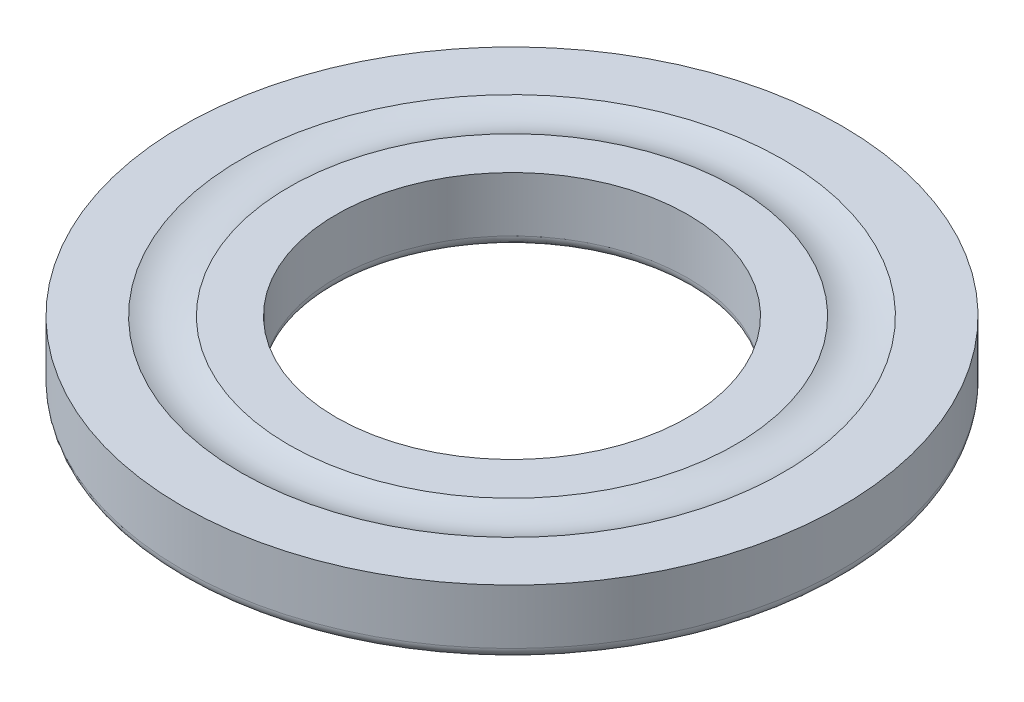
ISO-10303-21;
HEADER;
FILE_DESCRIPTION(('STEP AP214'),'2;1');
FILE_NAME('part.step','',(''),(''),'','','');
FILE_SCHEMA(('AUTOMOTIVE_DESIGN { 1 0 10303 214 1 1 1 1 }'));
ENDSEC;
DATA;
#1=APPLICATION_CONTEXT('core data for automotive mechanical design processes');
#2=APPLICATION_PROTOCOL_DEFINITION('international standard','automotive_design',2000,#1);
#3=PRODUCT_CONTEXT('',#1,'mechanical');
#4=PRODUCT('Part','Part','',(#3));
#5=PRODUCT_RELATED_PRODUCT_CATEGORY('part','',(#4));
#6=PRODUCT_DEFINITION_FORMATION('','',#4);
#7=PRODUCT_DEFINITION_CONTEXT('part definition',#1,'design');
#8=PRODUCT_DEFINITION('design','',#6,#7);
#9=PRODUCT_DEFINITION_SHAPE('','',#8);
#10=(LENGTH_UNIT() NAMED_UNIT(*) SI_UNIT(.MILLI.,.METRE.));
#11=(NAMED_UNIT(*) PLANE_ANGLE_UNIT() SI_UNIT($,.RADIAN.));
#12=(NAMED_UNIT(*) SI_UNIT($,.STERADIAN.) SOLID_ANGLE_UNIT());
#13=UNCERTAINTY_MEASURE_WITH_UNIT(LENGTH_MEASURE(1.E-05),#10,'distance_accuracy_value','');
#14=(GEOMETRIC_REPRESENTATION_CONTEXT(3) GLOBAL_UNCERTAINTY_ASSIGNED_CONTEXT((#13)) GLOBAL_UNIT_ASSIGNED_CONTEXT((#10,
#11,#12)) REPRESENTATION_CONTEXT('',''));
#15=CARTESIAN_POINT('',(0.,0.,0.));
#16=DIRECTION('',(0.,0.,1.));
#17=DIRECTION('',(1.,0.,0.));
#18=AXIS2_PLACEMENT_3D('',#15,#16,#17);
#19=CARTESIAN_POINT('',(0.,6.,0.));
#20=DIRECTION('',(0.,1.,0.));
#21=DIRECTION('',(0.,0.,1.));
#22=AXIS2_PLACEMENT_3D('',#19,#20,#21);
#23=CYLINDRICAL_SURFACE('',#22,30.);
#24=CARTESIAN_POINT('',(0.,1.,0.));
#25=DIRECTION('',(0.,1.,0.));
#26=DIRECTION('',(0.,0.,1.));
#27=AXIS2_PLACEMENT_3D('',#24,#25,#26);
#28=CIRCLE('',#27,30.);
#29=CARTESIAN_POINT('',(0.,1.,30.));
#30=VERTEX_POINT('',#29);
#31=EDGE_CURVE('E44',#30,#30,#28,.T.);
#32=ORIENTED_EDGE('',*,*,#31,.T.);
#33=EDGE_LOOP('',(#32));
#34=FACE_BOUND('',#33,.T.);
#35=CARTESIAN_POINT('',(0.,6.,0.));
#36=DIRECTION('',(0.,1.,0.));
#37=DIRECTION('',(0.,0.,1.));
#38=AXIS2_PLACEMENT_3D('',#35,#36,#37);
#39=CIRCLE('',#38,30.);
#40=CARTESIAN_POINT('',(0.,6.,30.));
#41=VERTEX_POINT('',#40);
#42=EDGE_CURVE('E41',#41,#41,#39,.T.);
#43=ORIENTED_EDGE('',*,*,#42,.F.);
#44=EDGE_LOOP('',(#43));
#45=FACE_BOUND('',#44,.T.);
#46=ADVANCED_FACE('F15',(#34,#45),#23,.T.);
#47=CARTESIAN_POINT('',(0.,0.999999999999221,0.));
#48=DIRECTION('',(0.,1.,0.));
#49=DIRECTION('',(0.,0.,1.));
#50=AXIS2_PLACEMENT_3D('',#47,#48,#49);
#51=TOROIDAL_SURFACE('',#50,29.0000000000008,0.99999999999922);
#52=CARTESIAN_POINT('',(0.,0.,0.));
#53=DIRECTION('',(0.,1.,0.));
#54=DIRECTION('',(0.,0.,1.));
#55=AXIS2_PLACEMENT_3D('',#52,#53,#54);
#56=CIRCLE('',#55,29.0000000000008);
#57=CARTESIAN_POINT('',(0.,0.,29.0000000000008));
#58=VERTEX_POINT('',#57);
#59=EDGE_CURVE('E38',#58,#58,#56,.T.);
#60=ORIENTED_EDGE('',*,*,#59,.T.);
#61=EDGE_LOOP('',(#60));
#62=FACE_BOUND('',#61,.T.);
#63=ORIENTED_EDGE('',*,*,#31,.F.);
#64=EDGE_LOOP('',(#63));
#65=FACE_BOUND('',#64,.T.);
#66=ADVANCED_FACE('F50',(#62,#65),#51,.T.);
#67=CARTESIAN_POINT('',(-24.681742652102,6.,0.));
#68=DIRECTION('',(0.,1.,0.));
#69=DIRECTION('',(0.,0.,1.));
#70=AXIS2_PLACEMENT_3D('',#67,#68,#69);
#71=PLANE('',#70);
#72=ORIENTED_EDGE('',*,*,#42,.T.);
#73=EDGE_LOOP('',(#72));
#74=FACE_BOUND('',#73,.T.);
#75=CARTESIAN_POINT('',(0.,6.,0.));
#76=DIRECTION('',(0.,1.,0.));
#77=DIRECTION('',(0.,0.,1.));
#78=AXIS2_PLACEMENT_3D('',#75,#76,#77);
#79=CIRCLE('',#78,24.681742652102);
#80=CARTESIAN_POINT('',(0.,6.,24.681742652102));
#81=VERTEX_POINT('',#80);
#82=EDGE_CURVE('E35',#81,#81,#79,.T.);
#83=ORIENTED_EDGE('',*,*,#82,.F.);
#84=EDGE_LOOP('',(#83));
#85=FACE_BOUND('',#84,.T.);
#86=ADVANCED_FACE('F52',(#74,#85),#71,.T.);
#87=CARTESIAN_POINT('',(-29.,0.,0.));
#88=DIRECTION('',(0.,-1.,0.));
#89=DIRECTION('',(0.,0.,-1.));
#90=AXIS2_PLACEMENT_3D('',#87,#88,#89);
#91=PLANE('',#90);
#92=CARTESIAN_POINT('',(0.,0.,0.));
#93=DIRECTION('',(0.,1.,0.));
#94=DIRECTION('',(0.,0.,1.));
#95=AXIS2_PLACEMENT_3D('',#92,#93,#94);
#96=CIRCLE('',#95,16.9999999999992);
#97=CARTESIAN_POINT('',(0.,0.,16.9999999999992));
#98=VERTEX_POINT('',#97);
#99=EDGE_CURVE('E30',#98,#98,#96,.T.);
#100=ORIENTED_EDGE('',*,*,#99,.T.);
#101=EDGE_LOOP('',(#100));
#102=FACE_BOUND('',#101,.T.);
#103=ORIENTED_EDGE('',*,*,#59,.F.);
#104=EDGE_LOOP('',(#103));
#105=FACE_BOUND('',#104,.T.);
#106=ADVANCED_FACE('F60',(#102,#105),#91,.T.);
#107=CARTESIAN_POINT('',(0.,10.500000000001,0.));
#108=DIRECTION('',(0.,1.,0.));
#109=DIRECTION('',(0.,0.,1.));
#110=AXIS2_PLACEMENT_3D('',#107,#108,#109);
#111=TOROIDAL_SURFACE('',#110,22.5,5.00100000000105);
#112=CARTESIAN_POINT('',(0.,6.,0.));
#113=DIRECTION('',(0.,1.,0.));
#114=DIRECTION('',(0.,0.,1.));
#115=AXIS2_PLACEMENT_3D('',#112,#113,#114);
#116=CIRCLE('',#115,20.318257347898);
#117=CARTESIAN_POINT('',(0.,6.,20.318257347898));
#118=VERTEX_POINT('',#117);
#119=EDGE_CURVE('E26',#118,#118,#116,.T.);
#120=ORIENTED_EDGE('',*,*,#119,.F.);
#121=EDGE_LOOP('',(#120));
#122=FACE_BOUND('',#121,.T.);
#123=ORIENTED_EDGE('',*,*,#82,.T.);
#124=EDGE_LOOP('',(#123));
#125=FACE_BOUND('',#124,.T.);
#126=ADVANCED_FACE('F67',(#122,#125),#111,.F.);
#127=CARTESIAN_POINT('',(0.,0.999999999999219,0.));
#128=DIRECTION('',(0.,1.,0.));
#129=DIRECTION('',(0.,0.,1.));
#130=AXIS2_PLACEMENT_3D('',#127,#128,#129);
#131=TOROIDAL_SURFACE('',#130,16.9999999999992,0.999999999999219);
#132=CARTESIAN_POINT('',(0.,1.,0.));
#133=DIRECTION('',(0.,1.,0.));
#134=DIRECTION('',(0.,0.,1.));
#135=AXIS2_PLACEMENT_3D('',#132,#133,#134);
#136=CIRCLE('',#135,16.);
#137=CARTESIAN_POINT('',(0.,1.,16.));
#138=VERTEX_POINT('',#137);
#139=EDGE_CURVE('E22',#138,#138,#136,.T.);
#140=ORIENTED_EDGE('',*,*,#139,.T.);
#141=EDGE_LOOP('',(#140));
#142=FACE_BOUND('',#141,.T.);
#143=ORIENTED_EDGE('',*,*,#99,.F.);
#144=EDGE_LOOP('',(#143));
#145=FACE_BOUND('',#144,.T.);
#146=ADVANCED_FACE('F71',(#142,#145),#131,.T.);
#147=CARTESIAN_POINT('',(-16.,6.,0.));
#148=DIRECTION('',(0.,1.,0.));
#149=DIRECTION('',(0.,0.,1.));
#150=AXIS2_PLACEMENT_3D('',#147,#148,#149);
#151=PLANE('',#150);
#152=ORIENTED_EDGE('',*,*,#119,.T.);
#153=EDGE_LOOP('',(#152));
#154=FACE_BOUND('',#153,.T.);
#155=CARTESIAN_POINT('',(0.,6.,0.));
#156=DIRECTION('',(0.,1.,0.));
#157=DIRECTION('',(0.,0.,1.));
#158=AXIS2_PLACEMENT_3D('',#155,#156,#157);
#159=CIRCLE('',#158,16.);
#160=CARTESIAN_POINT('',(0.,6.,16.));
#161=VERTEX_POINT('',#160);
#162=EDGE_CURVE('E10',#161,#161,#159,.T.);
#163=ORIENTED_EDGE('',*,*,#162,.F.);
#164=EDGE_LOOP('',(#163));
#165=FACE_BOUND('',#164,.T.);
#166=ADVANCED_FACE('F74',(#154,#165),#151,.T.);
#167=CARTESIAN_POINT('',(0.,6.,0.));
#168=DIRECTION('',(0.,1.,0.));
#169=DIRECTION('',(0.,0.,1.));
#170=AXIS2_PLACEMENT_3D('',#167,#168,#169);
#171=CYLINDRICAL_SURFACE('',#170,16.);
#172=ORIENTED_EDGE('',*,*,#162,.T.);
#173=EDGE_LOOP('',(#172));
#174=FACE_BOUND('',#173,.T.);
#175=ORIENTED_EDGE('',*,*,#139,.F.);
#176=EDGE_LOOP('',(#175));
#177=FACE_BOUND('',#176,.T.);
#178=ADVANCED_FACE('F17',(#174,#177),#171,.F.);
#179=CLOSED_SHELL('',(#46,#66,#86,#106,#126,#146,#166,#178));
#180=MANIFOLD_SOLID_BREP('B1',#179);
#181=ADVANCED_BREP_SHAPE_REPRESENTATION('',(#18,#180),#14);
#182=SHAPE_DEFINITION_REPRESENTATION(#9,#181);
ENDSEC;
END-ISO-10303-21;
